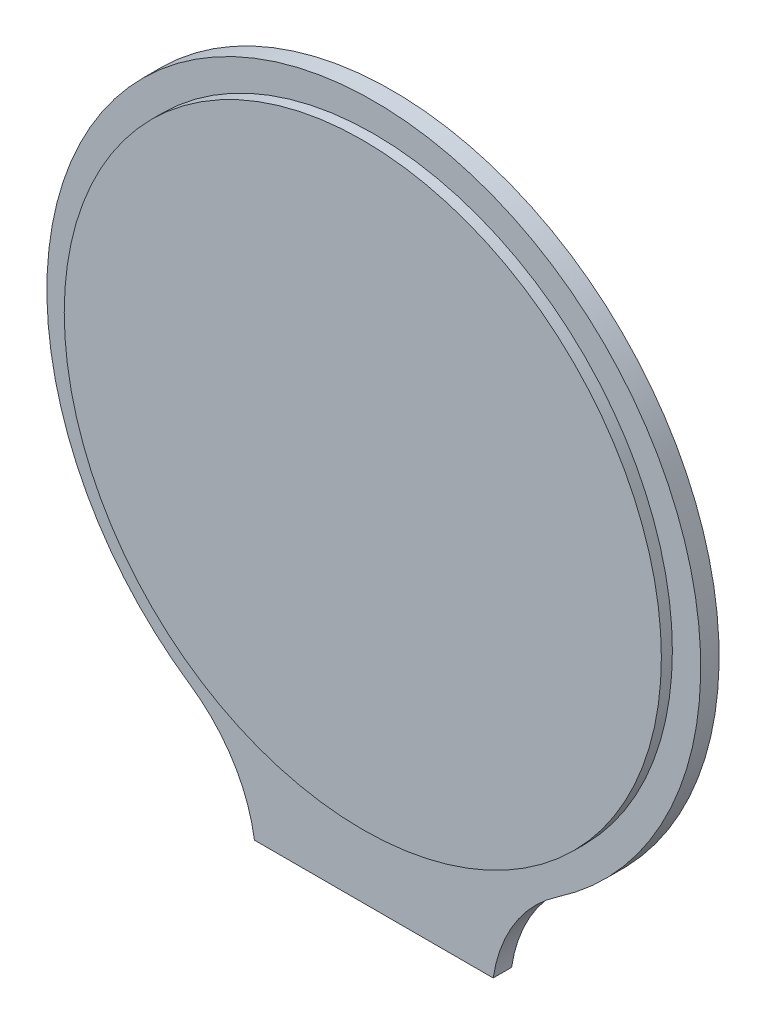
ISO-10303-21;
HEADER;
FILE_DESCRIPTION(('STEP AP214'),'2;1');
FILE_NAME('part.step','',(''),(''),'','','');
FILE_SCHEMA(('AUTOMOTIVE_DESIGN { 1 0 10303 214 1 1 1 1 }'));
ENDSEC;
DATA;
#1=APPLICATION_CONTEXT('core data for automotive mechanical design processes');
#2=APPLICATION_PROTOCOL_DEFINITION('international standard','automotive_design',2000,#1);
#3=PRODUCT_CONTEXT('',#1,'mechanical');
#4=PRODUCT('Part','Part','',(#3));
#5=PRODUCT_RELATED_PRODUCT_CATEGORY('part','',(#4));
#6=PRODUCT_DEFINITION_FORMATION('','',#4);
#7=PRODUCT_DEFINITION_CONTEXT('part definition',#1,'design');
#8=PRODUCT_DEFINITION('design','',#6,#7);
#9=PRODUCT_DEFINITION_SHAPE('','',#8);
#10=(LENGTH_UNIT() NAMED_UNIT(*) SI_UNIT(.MILLI.,.METRE.));
#11=(NAMED_UNIT(*) PLANE_ANGLE_UNIT() SI_UNIT($,.RADIAN.));
#12=(NAMED_UNIT(*) SI_UNIT($,.STERADIAN.) SOLID_ANGLE_UNIT());
#13=UNCERTAINTY_MEASURE_WITH_UNIT(LENGTH_MEASURE(1.E-05),#10,'distance_accuracy_value','');
#14=(GEOMETRIC_REPRESENTATION_CONTEXT(3) GLOBAL_UNCERTAINTY_ASSIGNED_CONTEXT((#13)) GLOBAL_UNIT_ASSIGNED_CONTEXT((#10,
#11,#12)) REPRESENTATION_CONTEXT('',''));
#15=CARTESIAN_POINT('',(0.,0.,0.));
#16=DIRECTION('',(0.,0.,1.));
#17=DIRECTION('',(1.,0.,0.));
#18=AXIS2_PLACEMENT_3D('',#15,#16,#17);
#19=CARTESIAN_POINT('',(-14.6194376350798,-21.5118492224368,1.));
#20=DIRECTION('',(0.,0.,-1.));
#21=DIRECTION('',(-1.,0.,0.));
#22=AXIS2_PLACEMENT_3D('',#19,#20,#21);
#23=CYLINDRICAL_SURFACE('',#22,8.20937549682497);
#24=CARTESIAN_POINT('',(-14.6194376350798,-21.5118492224368,0.));
#25=DIRECTION('',(0.,0.,-1.));
#26=DIRECTION('',(-1.,0.,0.));
#27=AXIS2_PLACEMENT_3D('',#24,#25,#26);
#28=CIRCLE('',#27,8.20937549682497);
#29=CARTESIAN_POINT('',(-10.0050841257679,-14.7220342220872,0.));
#30=VERTEX_POINT('',#29);
#31=CARTESIAN_POINT('',(-6.5,-20.3,0.));
#32=VERTEX_POINT('',#31);
#33=EDGE_CURVE('E122',#30,#32,#28,.T.);
#34=ORIENTED_EDGE('',*,*,#33,.T.);
#35=DIRECTION('',(0.,0.,-1.));
#36=VECTOR('',#35,1.);
#37=CARTESIAN_POINT('',(-6.5,-20.3,1.));
#38=LINE('',#37,#36);
#39=CARTESIAN_POINT('',(-6.5,-20.3,1.));
#40=VERTEX_POINT('',#39);
#41=EDGE_CURVE('E54',#40,#32,#38,.T.);
#42=ORIENTED_EDGE('',*,*,#41,.F.);
#43=CARTESIAN_POINT('',(-14.6194376350798,-21.5118492224368,1.));
#44=DIRECTION('',(0.,0.,-1.));
#45=DIRECTION('',(-1.,0.,0.));
#46=AXIS2_PLACEMENT_3D('',#43,#44,#45);
#47=CIRCLE('',#46,8.20937549682497);
#48=CARTESIAN_POINT('',(-10.0050841257679,-14.7220342220872,1.));
#49=VERTEX_POINT('',#48);
#50=EDGE_CURVE('E105',#49,#40,#47,.T.);
#51=ORIENTED_EDGE('',*,*,#50,.F.);
#52=DIRECTION('',(0.,0.,-1.));
#53=VECTOR('',#52,1.);
#54=CARTESIAN_POINT('',(-10.0050841257679,-14.7220342220872,1.));
#55=LINE('',#54,#53);
#56=EDGE_CURVE('E118',#49,#30,#55,.T.);
#57=ORIENTED_EDGE('',*,*,#56,.T.);
#58=EDGE_LOOP('',(#34,#42,#51,#57));
#59=FACE_BOUND('',#58,.T.);
#60=ADVANCED_FACE('F51',(#59),#23,.F.);
#61=CARTESIAN_POINT('',(-6.5,-20.3,1.));
#62=DIRECTION('',(0.,1.,0.));
#63=DIRECTION('',(0.,0.,1.));
#64=AXIS2_PLACEMENT_3D('',#61,#62,#63);
#65=PLANE('',#64);
#66=DIRECTION('',(1.,0.,0.));
#67=VECTOR('',#66,1.);
#68=CARTESIAN_POINT('',(-6.5,-20.3,0.));
#69=LINE('',#68,#67);
#70=CARTESIAN_POINT('',(6.5,-20.3,0.));
#71=VERTEX_POINT('',#70);
#72=EDGE_CURVE('E111',#32,#71,#69,.T.);
#73=ORIENTED_EDGE('',*,*,#72,.T.);
#74=DIRECTION('',(0.,0.,-1.));
#75=VECTOR('',#74,1.);
#76=CARTESIAN_POINT('',(6.5,-20.3,1.));
#77=LINE('',#76,#75);
#78=CARTESIAN_POINT('',(6.5,-20.3,1.));
#79=VERTEX_POINT('',#78);
#80=EDGE_CURVE('E109',#79,#71,#77,.T.);
#81=ORIENTED_EDGE('',*,*,#80,.F.);
#82=DIRECTION('',(1.,0.,0.));
#83=VECTOR('',#82,1.);
#84=CARTESIAN_POINT('',(-6.5,-20.3,1.));
#85=LINE('',#84,#83);
#86=EDGE_CURVE('E100',#40,#79,#85,.T.);
#87=ORIENTED_EDGE('',*,*,#86,.F.);
#88=ORIENTED_EDGE('',*,*,#41,.T.);
#89=EDGE_LOOP('',(#73,#81,#87,#88));
#90=FACE_BOUND('',#89,.T.);
#91=ADVANCED_FACE('F110',(#90),#65,.F.);
#92=CARTESIAN_POINT('',(14.6194376350798,-21.5118492224368,1.));
#93=DIRECTION('',(0.,0.,-1.));
#94=DIRECTION('',(-1.,0.,0.));
#95=AXIS2_PLACEMENT_3D('',#92,#93,#94);
#96=CYLINDRICAL_SURFACE('',#95,8.209375496825);
#97=CARTESIAN_POINT('',(14.6194376350798,-21.5118492224368,0.));
#98=DIRECTION('',(0.,0.,-1.));
#99=DIRECTION('',(1.,0.,0.));
#100=AXIS2_PLACEMENT_3D('',#97,#98,#99);
#101=CIRCLE('',#100,8.209375496825);
#102=CARTESIAN_POINT('',(10.0050841257679,-14.7220342220872,0.));
#103=VERTEX_POINT('',#102);
#104=EDGE_CURVE('E86',#71,#103,#101,.T.);
#105=ORIENTED_EDGE('',*,*,#104,.T.);
#106=DIRECTION('',(0.,0.,-1.));
#107=VECTOR('',#106,1.);
#108=CARTESIAN_POINT('',(10.0050841257679,-14.7220342220872,1.));
#109=LINE('',#108,#107);
#110=CARTESIAN_POINT('',(10.0050841257679,-14.7220342220872,1.));
#111=VERTEX_POINT('',#110);
#112=EDGE_CURVE('E113',#111,#103,#109,.T.);
#113=ORIENTED_EDGE('',*,*,#112,.F.);
#114=CARTESIAN_POINT('',(14.6194376350798,-21.5118492224368,1.));
#115=DIRECTION('',(0.,0.,-1.));
#116=DIRECTION('',(1.,0.,0.));
#117=AXIS2_PLACEMENT_3D('',#114,#115,#116);
#118=CIRCLE('',#117,8.209375496825);
#119=EDGE_CURVE('E103',#79,#111,#118,.T.);
#120=ORIENTED_EDGE('',*,*,#119,.F.);
#121=ORIENTED_EDGE('',*,*,#80,.T.);
#122=EDGE_LOOP('',(#105,#113,#120,#121));
#123=FACE_BOUND('',#122,.T.);
#124=ADVANCED_FACE('F114',(#123),#96,.F.);
#125=CARTESIAN_POINT('',(0.,0.,1.));
#126=DIRECTION('',(0.,0.,-1.));
#127=DIRECTION('',(-1.,0.,0.));
#128=AXIS2_PLACEMENT_3D('',#125,#126,#127);
#129=CYLINDRICAL_SURFACE('',#128,17.8);
#130=CARTESIAN_POINT('',(0.,0.,0.));
#131=DIRECTION('',(0.,0.,1.));
#132=DIRECTION('',(1.,0.,0.));
#133=AXIS2_PLACEMENT_3D('',#130,#131,#132);
#134=CIRCLE('',#133,17.8);
#135=EDGE_CURVE('E92',#103,#30,#134,.T.);
#136=ORIENTED_EDGE('',*,*,#135,.T.);
#137=ORIENTED_EDGE('',*,*,#56,.F.);
#138=CARTESIAN_POINT('',(0.,0.,1.));
#139=DIRECTION('',(0.,0.,1.));
#140=DIRECTION('',(1.,0.,0.));
#141=AXIS2_PLACEMENT_3D('',#138,#139,#140);
#142=CIRCLE('',#141,17.8);
#143=EDGE_CURVE('E69',#111,#49,#142,.T.);
#144=ORIENTED_EDGE('',*,*,#143,.F.);
#145=ORIENTED_EDGE('',*,*,#112,.T.);
#146=EDGE_LOOP('',(#136,#137,#144,#145));
#147=FACE_BOUND('',#146,.T.);
#148=ADVANCED_FACE('F136',(#147),#129,.T.);
#149=CARTESIAN_POINT('',(-14.6194376350798,-21.5118492224368,1.));
#150=DIRECTION('',(0.,0.,-1.));
#151=DIRECTION('',(-1.,0.,0.));
#152=AXIS2_PLACEMENT_3D('',#149,#150,#151);
#153=PLANE('',#152);
#154=CARTESIAN_POINT('',(0.,0.,1.));
#155=DIRECTION('',(0.,0.,1.));
#156=DIRECTION('',(1.,0.,0.));
#157=AXIS2_PLACEMENT_3D('',#154,#155,#156);
#158=CIRCLE('',#157,16.256);
#159=CARTESIAN_POINT('',(16.256,0.,1.));
#160=VERTEX_POINT('',#159);
#161=EDGE_CURVE('E11',#160,#160,#158,.T.);
#162=ORIENTED_EDGE('',*,*,#161,.F.);
#163=EDGE_LOOP('',(#162));
#164=FACE_BOUND('',#163,.T.);
#165=ORIENTED_EDGE('',*,*,#50,.T.);
#166=ORIENTED_EDGE('',*,*,#86,.T.);
#167=ORIENTED_EDGE('',*,*,#119,.T.);
#168=ORIENTED_EDGE('',*,*,#143,.T.);
#169=EDGE_LOOP('',(#165,#166,#167,#168));
#170=FACE_BOUND('',#169,.T.);
#171=ADVANCED_FACE('F101',(#164,#170),#153,.F.);
#172=CARTESIAN_POINT('',(-14.6194376350798,-21.5118492224368,0.));
#173=DIRECTION('',(0.,0.,-1.));
#174=DIRECTION('',(-1.,0.,0.));
#175=AXIS2_PLACEMENT_3D('',#172,#173,#174);
#176=PLANE('',#175);
#177=ORIENTED_EDGE('',*,*,#33,.F.);
#178=ORIENTED_EDGE('',*,*,#135,.F.);
#179=ORIENTED_EDGE('',*,*,#104,.F.);
#180=ORIENTED_EDGE('',*,*,#72,.F.);
#181=EDGE_LOOP('',(#177,#178,#179,#180));
#182=FACE_BOUND('',#181,.T.);
#183=ADVANCED_FACE('F139',(#182),#176,.T.);
#184=CARTESIAN_POINT('',(0.,0.,1.6));
#185=DIRECTION('',(0.,0.,-1.));
#186=DIRECTION('',(-1.,0.,0.));
#187=AXIS2_PLACEMENT_3D('',#184,#185,#186);
#188=CYLINDRICAL_SURFACE('',#187,16.256);
#189=CARTESIAN_POINT('',(0.,0.,1.6));
#190=DIRECTION('',(0.,0.,1.));
#191=DIRECTION('',(1.,0.,0.));
#192=AXIS2_PLACEMENT_3D('',#189,#190,#191);
#193=CIRCLE('',#192,16.256);
#194=CARTESIAN_POINT('',(16.256,0.,1.6));
#195=VERTEX_POINT('',#194);
#196=EDGE_CURVE('E126',#195,#195,#193,.T.);
#197=ORIENTED_EDGE('',*,*,#196,.F.);
#198=EDGE_LOOP('',(#197));
#199=FACE_BOUND('',#198,.T.);
#200=ORIENTED_EDGE('',*,*,#161,.T.);
#201=EDGE_LOOP('',(#200));
#202=FACE_BOUND('',#201,.T.);
#203=ADVANCED_FACE('F149',(#199,#202),#188,.T.);
#204=CARTESIAN_POINT('',(0.,0.,1.6));
#205=DIRECTION('',(0.,0.,1.));
#206=DIRECTION('',(1.,0.,0.));
#207=AXIS2_PLACEMENT_3D('',#204,#205,#206);
#208=PLANE('',#207);
#209=ORIENTED_EDGE('',*,*,#196,.T.);
#210=EDGE_LOOP('',(#209));
#211=FACE_BOUND('',#210,.T.);
#212=ADVANCED_FACE('F147',(#211),#208,.T.);
#213=CLOSED_SHELL('',(#60,#91,#124,#148,#171,#183,#203,#212));
#214=MANIFOLD_SOLID_BREP('B2',#213);
#215=ADVANCED_BREP_SHAPE_REPRESENTATION('',(#18,#214),#14);
#216=SHAPE_DEFINITION_REPRESENTATION(#9,#215);
ENDSEC;
END-ISO-10303-21;
